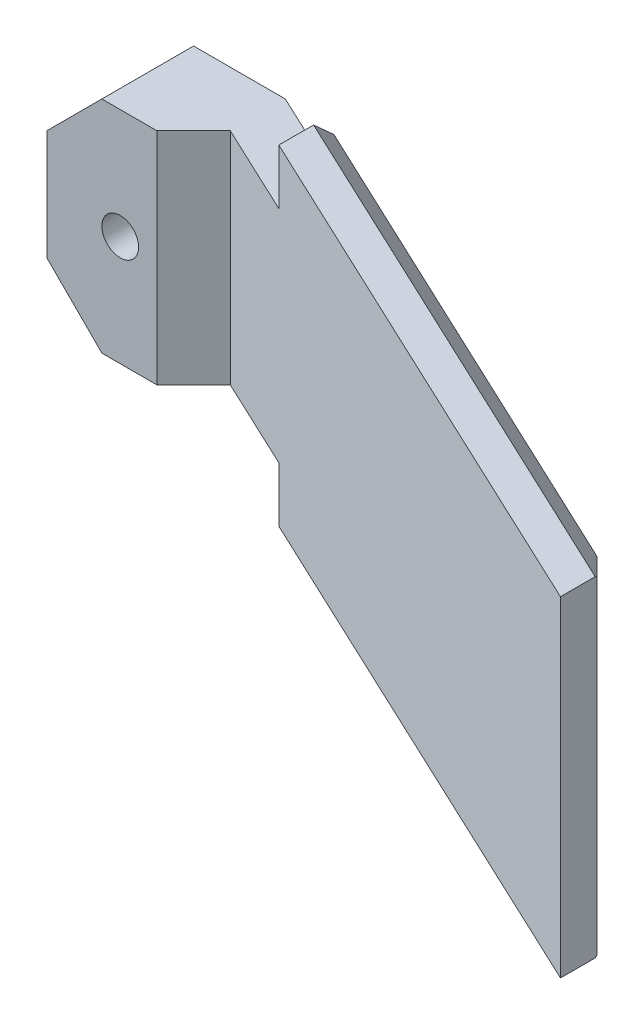
ISO-10303-21;
HEADER;
FILE_DESCRIPTION(('STEP AP214'),'2;1');
FILE_NAME('part.step','',(''),(''),'','','');
FILE_SCHEMA(('AUTOMOTIVE_DESIGN { 1 0 10303 214 1 1 1 1 }'));
ENDSEC;
DATA;
#1=APPLICATION_CONTEXT('core data for automotive mechanical design processes');
#2=APPLICATION_PROTOCOL_DEFINITION('international standard','automotive_design',2000,#1);
#3=PRODUCT_CONTEXT('',#1,'mechanical');
#4=PRODUCT('Part','Part','',(#3));
#5=PRODUCT_RELATED_PRODUCT_CATEGORY('part','',(#4));
#6=PRODUCT_DEFINITION_FORMATION('','',#4);
#7=PRODUCT_DEFINITION_CONTEXT('part definition',#1,'design');
#8=PRODUCT_DEFINITION('design','',#6,#7);
#9=PRODUCT_DEFINITION_SHAPE('','',#8);
#10=(LENGTH_UNIT() NAMED_UNIT(*) SI_UNIT(.MILLI.,.METRE.));
#11=(NAMED_UNIT(*) PLANE_ANGLE_UNIT() SI_UNIT($,.RADIAN.));
#12=(NAMED_UNIT(*) SI_UNIT($,.STERADIAN.) SOLID_ANGLE_UNIT());
#13=UNCERTAINTY_MEASURE_WITH_UNIT(LENGTH_MEASURE(1.E-05),#10,'distance_accuracy_value','');
#14=(GEOMETRIC_REPRESENTATION_CONTEXT(3) GLOBAL_UNCERTAINTY_ASSIGNED_CONTEXT((#13)) GLOBAL_UNIT_ASSIGNED_CONTEXT((#10,
#11,#12)) REPRESENTATION_CONTEXT('',''));
#15=CARTESIAN_POINT('',(0.,0.,0.));
#16=DIRECTION('',(0.,0.,1.));
#17=DIRECTION('',(1.,0.,0.));
#18=AXIS2_PLACEMENT_3D('',#15,#16,#17);
#19=CARTESIAN_POINT('',(4.,18.,-1.5));
#20=DIRECTION('',(-0.42579703632988,0.,0.904818702200994));
#21=DIRECTION('',(0.904818702200994,0.,0.42579703632988));
#22=AXIS2_PLACEMENT_3D('',#19,#20,#21);
#23=PLANE('',#22);
#24=DIRECTION('',(0.904818702200994,0.,0.42579703632988));
#25=VECTOR('',#24,1.);
#26=CARTESIAN_POINT('',(4.,17.,-1.5));
#27=LINE('',#26,#25);
#28=CARTESIAN_POINT('',(9.,17.,0.852941176470588));
#29=VERTEX_POINT('',#28);
#30=CARTESIAN_POINT('',(36.1111111111111,17.,13.6111111111111));
#31=VERTEX_POINT('',#30);
#32=EDGE_CURVE('E210',#29,#31,#27,.T.);
#33=ORIENTED_EDGE('',*,*,#32,.T.);
#34=DIRECTION('',(0.,-1.,0.));
#35=VECTOR('',#34,1.);
#36=CARTESIAN_POINT('',(36.1111111111111,18.,13.6111111111111));
#37=LINE('',#36,#35);
#38=CARTESIAN_POINT('',(36.1111111111111,1.,13.6111111111111));
#39=VERTEX_POINT('',#38);
#40=EDGE_CURVE('E236',#31,#39,#37,.T.);
#41=ORIENTED_EDGE('',*,*,#40,.T.);
#42=DIRECTION('',(-0.904818702200994,0.,-0.42579703632988));
#43=VECTOR('',#42,1.);
#44=CARTESIAN_POINT('',(9.,1.,0.852941176470587));
#45=LINE('',#44,#43);
#46=CARTESIAN_POINT('',(9.,1.,0.852941176470587));
#47=VERTEX_POINT('',#46);
#48=EDGE_CURVE('E213',#39,#47,#45,.T.);
#49=ORIENTED_EDGE('',*,*,#48,.T.);
#50=DIRECTION('',(0.,1.,0.));
#51=VECTOR('',#50,1.);
#52=CARTESIAN_POINT('',(9.,18.,0.852941176470587));
#53=LINE('',#52,#51);
#54=CARTESIAN_POINT('',(9.,3.,0.852941176470592));
#55=VERTEX_POINT('',#54);
#56=EDGE_CURVE('E178',#47,#55,#53,.T.);
#57=ORIENTED_EDGE('',*,*,#56,.T.);
#58=DIRECTION('',(-0.904818702200994,0.,-0.42579703632988));
#59=VECTOR('',#58,1.);
#60=CARTESIAN_POINT('',(4.,3.,-1.5));
#61=LINE('',#60,#59);
#62=CARTESIAN_POINT('',(4.,3.,-1.5));
#63=VERTEX_POINT('',#62);
#64=EDGE_CURVE('E162',#55,#63,#61,.T.);
#65=ORIENTED_EDGE('',*,*,#64,.T.);
#66=DIRECTION('',(0.,-1.,0.));
#67=VECTOR('',#66,1.);
#68=CARTESIAN_POINT('',(4.,18.,-1.5));
#69=LINE('',#68,#67);
#70=CARTESIAN_POINT('',(4.,15.,-1.5));
#71=VERTEX_POINT('',#70);
#72=EDGE_CURVE('E176',#71,#63,#69,.T.);
#73=ORIENTED_EDGE('',*,*,#72,.F.);
#74=DIRECTION('',(0.904818702200994,0.,0.42579703632988));
#75=VECTOR('',#74,1.);
#76=CARTESIAN_POINT('',(4.,15.,-1.5));
#77=LINE('',#76,#75);
#78=CARTESIAN_POINT('',(9.,15.,0.852941176470588));
#79=VERTEX_POINT('',#78);
#80=EDGE_CURVE('E180',#71,#79,#77,.T.);
#81=ORIENTED_EDGE('',*,*,#80,.T.);
#82=DIRECTION('',(0.,1.,0.));
#83=VECTOR('',#82,1.);
#84=CARTESIAN_POINT('',(9.,18.,0.852941176470588));
#85=LINE('',#84,#83);
#86=EDGE_CURVE('E181',#79,#29,#85,.T.);
#87=ORIENTED_EDGE('',*,*,#86,.T.);
#88=EDGE_LOOP('',(#33,#41,#49,#57,#65,#73,#81,#87));
#89=FACE_BOUND('',#88,.T.);
#90=ADVANCED_FACE('F44',(#89),#23,.F.);
#91=CARTESIAN_POINT('',(-4.,18.,-1.5));
#92=DIRECTION('',(0.,0.,1.));
#93=DIRECTION('',(1.,0.,0.));
#94=AXIS2_PLACEMENT_3D('',#91,#92,#93);
#95=PLANE('',#94);
#96=CARTESIAN_POINT('',(0.,9.,-1.5));
#97=DIRECTION('',(0.,0.,-1.));
#98=DIRECTION('',(-1.,0.,0.));
#99=AXIS2_PLACEMENT_3D('',#96,#97,#98);
#100=CIRCLE('',#99,2.5);
#101=CARTESIAN_POINT('',(-2.5,9.,-1.5));
#102=VERTEX_POINT('',#101);
#103=EDGE_CURVE('E316',#102,#102,#100,.T.);
#104=ORIENTED_EDGE('',*,*,#103,.F.);
#105=EDGE_LOOP('',(#104));
#106=FACE_BOUND('',#105,.T.);
#107=DIRECTION('',(0.,-1.,0.));
#108=VECTOR('',#107,1.);
#109=CARTESIAN_POINT('',(-4.,18.,-1.5));
#110=LINE('',#109,#108);
#111=CARTESIAN_POINT('',(-4.,12.,-1.5));
#112=VERTEX_POINT('',#111);
#113=CARTESIAN_POINT('',(-4.,6.00000000000001,-1.5));
#114=VERTEX_POINT('',#113);
#115=EDGE_CURVE('E189',#112,#114,#110,.T.);
#116=ORIENTED_EDGE('',*,*,#115,.F.);
#117=DIRECTION('',(-0.707106781186548,-0.707106781186547,0.));
#118=VECTOR('',#117,1.);
#119=CARTESIAN_POINT('',(-4.,12.,-1.5));
#120=LINE('',#119,#118);
#121=CARTESIAN_POINT('',(-0.99999999999999,15.,-1.5));
#122=VERTEX_POINT('',#121);
#123=EDGE_CURVE('E265',#112,#122,#120,.F.);
#124=ORIENTED_EDGE('',*,*,#123,.T.);
#125=DIRECTION('',(-1.,0.,0.));
#126=VECTOR('',#125,1.);
#127=CARTESIAN_POINT('',(-4.,15.,-1.5));
#128=LINE('',#127,#126);
#129=EDGE_CURVE('E169',#71,#122,#128,.T.);
#130=ORIENTED_EDGE('',*,*,#129,.F.);
#131=ORIENTED_EDGE('',*,*,#72,.T.);
#132=DIRECTION('',(1.,0.,0.));
#133=VECTOR('',#132,1.);
#134=CARTESIAN_POINT('',(-4.,3.,-1.5));
#135=LINE('',#134,#133);
#136=CARTESIAN_POINT('',(-1.,3.,-1.5));
#137=VERTEX_POINT('',#136);
#138=EDGE_CURVE('E158',#137,#63,#135,.T.);
#139=ORIENTED_EDGE('',*,*,#138,.F.);
#140=DIRECTION('',(0.707106781186546,-0.707106781186549,0.));
#141=VECTOR('',#140,1.);
#142=CARTESIAN_POINT('',(-1.,3.,-1.5));
#143=LINE('',#142,#141);
#144=EDGE_CURVE('E262',#137,#114,#143,.F.);
#145=ORIENTED_EDGE('',*,*,#144,.T.);
#146=EDGE_LOOP('',(#116,#124,#130,#131,#139,#145));
#147=FACE_BOUND('',#146,.T.);
#148=ADVANCED_FACE('F185',(#106,#147),#95,.F.);
#149=CARTESIAN_POINT('',(-4.,18.,1.5));
#150=DIRECTION('',(1.,0.,0.));
#151=DIRECTION('',(0.,0.,-1.));
#152=AXIS2_PLACEMENT_3D('',#149,#150,#151);
#153=PLANE('',#152);
#154=DIRECTION('',(0.,-1.,0.));
#155=VECTOR('',#154,1.);
#156=CARTESIAN_POINT('',(-4.,15.,3.5));
#157=LINE('',#156,#155);
#158=CARTESIAN_POINT('',(-4.,12.,3.5));
#159=VERTEX_POINT('',#158);
#160=CARTESIAN_POINT('',(-4.,6.00000000000001,3.5));
#161=VERTEX_POINT('',#160);
#162=EDGE_CURVE('E346',#159,#161,#157,.T.);
#163=ORIENTED_EDGE('',*,*,#162,.F.);
#164=DIRECTION('',(0.,0.,-1.));
#165=VECTOR('',#164,1.);
#166=CARTESIAN_POINT('',(-4.,12.,1.5));
#167=LINE('',#166,#165);
#168=EDGE_CURVE('E258',#159,#112,#167,.T.);
#169=ORIENTED_EDGE('',*,*,#168,.T.);
#170=ORIENTED_EDGE('',*,*,#115,.T.);
#171=DIRECTION('',(0.,0.,1.));
#172=VECTOR('',#171,1.);
#173=CARTESIAN_POINT('',(-4.,6.00000000000001,1.5));
#174=LINE('',#173,#172);
#175=EDGE_CURVE('E249',#114,#161,#174,.T.);
#176=ORIENTED_EDGE('',*,*,#175,.T.);
#177=EDGE_LOOP('',(#163,#169,#170,#176));
#178=FACE_BOUND('',#177,.T.);
#179=ADVANCED_FACE('F373',(#178),#153,.F.);
#180=CARTESIAN_POINT('',(4.,18.,1.5));
#181=DIRECTION('',(0.42579703632988,0.,-0.904818702200994));
#182=DIRECTION('',(-0.904818702200994,0.,-0.42579703632988));
#183=AXIS2_PLACEMENT_3D('',#180,#181,#182);
#184=PLANE('',#183);
#185=DIRECTION('',(0.,-1.,0.));
#186=VECTOR('',#185,1.);
#187=CARTESIAN_POINT('',(9.,18.,3.85294117647059));
#188=LINE('',#187,#186);
#189=CARTESIAN_POINT('',(9.,18.,3.85294117647059));
#190=VERTEX_POINT('',#189);
#191=CARTESIAN_POINT('',(9.,15.,3.85294117647059));
#192=VERTEX_POINT('',#191);
#193=EDGE_CURVE('E294',#190,#192,#188,.T.);
#194=ORIENTED_EDGE('',*,*,#193,.T.);
#195=DIRECTION('',(-0.904818702200994,0.,-0.42579703632988));
#196=VECTOR('',#195,1.);
#197=CARTESIAN_POINT('',(4.,15.,1.5));
#198=LINE('',#197,#196);
#199=CARTESIAN_POINT('',(4.,15.,1.5));
#200=VERTEX_POINT('',#199);
#201=EDGE_CURVE('E206',#192,#200,#198,.T.);
#202=ORIENTED_EDGE('',*,*,#201,.T.);
#203=DIRECTION('',(0.,-1.,0.));
#204=VECTOR('',#203,1.);
#205=CARTESIAN_POINT('',(4.,18.,1.5));
#206=LINE('',#205,#204);
#207=CARTESIAN_POINT('',(4.,3.,1.5));
#208=VERTEX_POINT('',#207);
#209=EDGE_CURVE('E196',#200,#208,#206,.T.);
#210=ORIENTED_EDGE('',*,*,#209,.T.);
#211=DIRECTION('',(0.904818702200994,0.,0.42579703632988));
#212=VECTOR('',#211,1.);
#213=CARTESIAN_POINT('',(4.,3.,1.5));
#214=LINE('',#213,#212);
#215=CARTESIAN_POINT('',(9.,3.,3.85294117647059));
#216=VERTEX_POINT('',#215);
#217=EDGE_CURVE('E202',#208,#216,#214,.T.);
#218=ORIENTED_EDGE('',*,*,#217,.T.);
#219=DIRECTION('',(0.,-1.,0.));
#220=VECTOR('',#219,1.);
#221=CARTESIAN_POINT('',(9.,18.,3.85294117647059));
#222=LINE('',#221,#220);
#223=CARTESIAN_POINT('',(9.,0.,3.85294117647059));
#224=VERTEX_POINT('',#223);
#225=EDGE_CURVE('E332',#216,#224,#222,.T.);
#226=ORIENTED_EDGE('',*,*,#225,.T.);
#227=DIRECTION('',(0.904818702200994,0.,0.42579703632988));
#228=VECTOR('',#227,1.);
#229=CARTESIAN_POINT('',(4.,0.,1.5));
#230=LINE('',#229,#228);
#231=CARTESIAN_POINT('',(38.,0.,17.5));
#232=VERTEX_POINT('',#231);
#233=EDGE_CURVE('E307',#224,#232,#230,.T.);
#234=ORIENTED_EDGE('',*,*,#233,.T.);
#235=DIRECTION('',(0.,-1.,0.));
#236=VECTOR('',#235,1.);
#237=CARTESIAN_POINT('',(38.,18.,17.5));
#238=LINE('',#237,#236);
#239=CARTESIAN_POINT('',(38.,18.,17.5));
#240=VERTEX_POINT('',#239);
#241=EDGE_CURVE('E296',#240,#232,#238,.T.);
#242=ORIENTED_EDGE('',*,*,#241,.F.);
#243=DIRECTION('',(0.904818702200994,0.,0.42579703632988));
#244=VECTOR('',#243,1.);
#245=CARTESIAN_POINT('',(4.,18.,1.5));
#246=LINE('',#245,#244);
#247=EDGE_CURVE('E306',#190,#240,#246,.T.);
#248=ORIENTED_EDGE('',*,*,#247,.F.);
#249=EDGE_LOOP('',(#194,#202,#210,#218,#226,#234,#242,#248));
#250=FACE_BOUND('',#249,.T.);
#251=ADVANCED_FACE('F291',(#250),#184,.F.);
#252=CARTESIAN_POINT('',(38.,18.,14.5));
#253=DIRECTION('',(-1.,0.,0.));
#254=DIRECTION('',(0.,0.,1.));
#255=AXIS2_PLACEMENT_3D('',#252,#253,#254);
#256=PLANE('',#255);
#257=DIRECTION('',(0.,0.670936482269277,-0.741514825718359));
#258=VECTOR('',#257,1.);
#259=CARTESIAN_POINT('',(38.,8.96014957948787,5.70249221183795));
#260=LINE('',#259,#258);
#261=CARTESIAN_POINT('',(38.,0.,15.6051937781209));
#262=VERTEX_POINT('',#261);
#263=CARTESIAN_POINT('',(38.,0.0951812977990005,15.5));
#264=VERTEX_POINT('',#263);
#265=EDGE_CURVE('E225',#262,#264,#260,.T.);
#266=ORIENTED_EDGE('',*,*,#265,.T.);
#267=DIRECTION('',(0.,1.,0.));
#268=VECTOR('',#267,1.);
#269=CARTESIAN_POINT('',(38.,18.,15.5));
#270=LINE('',#269,#268);
#271=CARTESIAN_POINT('',(38.,17.904818702201,15.5));
#272=VERTEX_POINT('',#271);
#273=EDGE_CURVE('E243',#264,#272,#270,.T.);
#274=ORIENTED_EDGE('',*,*,#273,.T.);
#275=DIRECTION('',(0.,-0.67093648226928,-0.741514825718356));
#276=VECTOR('',#275,1.);
#277=CARTESIAN_POINT('',(38.,9.30876198034695,5.99969159463225));
#278=LINE('',#277,#276);
#279=CARTESIAN_POINT('',(38.,18.,15.6051937781209));
#280=VERTEX_POINT('',#279);
#281=EDGE_CURVE('E222',#272,#280,#278,.F.);
#282=ORIENTED_EDGE('',*,*,#281,.T.);
#283=DIRECTION('',(0.,0.,-1.));
#284=VECTOR('',#283,1.);
#285=CARTESIAN_POINT('',(38.,18.,14.5));
#286=LINE('',#285,#284);
#287=EDGE_CURVE('E299',#240,#280,#286,.T.);
#288=ORIENTED_EDGE('',*,*,#287,.F.);
#289=ORIENTED_EDGE('',*,*,#241,.T.);
#290=DIRECTION('',(0.,0.,-1.));
#291=VECTOR('',#290,1.);
#292=CARTESIAN_POINT('',(38.,0.,14.5));
#293=LINE('',#292,#291);
#294=EDGE_CURVE('E302',#232,#262,#293,.T.);
#295=ORIENTED_EDGE('',*,*,#294,.T.);
#296=EDGE_LOOP('',(#266,#274,#282,#288,#289,#295));
#297=FACE_BOUND('',#296,.T.);
#298=ADVANCED_FACE('F449',(#297),#256,.F.);
#299=CARTESIAN_POINT('',(0.,18.,0.));
#300=DIRECTION('',(0.,-1.,0.));
#301=DIRECTION('',(0.,0.,-1.));
#302=AXIS2_PLACEMENT_3D('',#299,#300,#301);
#303=PLANE('',#302);
#304=ORIENTED_EDGE('',*,*,#287,.T.);
#305=DIRECTION('',(-0.904818702200994,0.,-0.42579703632988));
#306=VECTOR('',#305,1.);
#307=CARTESIAN_POINT('',(0.877319110978902,18.,-1.86430311083017));
#308=LINE('',#307,#306);
#309=CARTESIAN_POINT('',(9.,18.,1.95813495459153));
#310=VERTEX_POINT('',#309);
#311=EDGE_CURVE('E229',#280,#310,#308,.T.);
#312=ORIENTED_EDGE('',*,*,#311,.T.);
#313=DIRECTION('',(0.,0.,1.));
#314=VECTOR('',#313,1.);
#315=CARTESIAN_POINT('',(9.,18.,0.));
#316=LINE('',#315,#314);
#317=EDGE_CURVE('E193',#310,#190,#316,.T.);
#318=ORIENTED_EDGE('',*,*,#317,.T.);
#319=ORIENTED_EDGE('',*,*,#247,.T.);
#320=EDGE_LOOP('',(#304,#312,#318,#319));
#321=FACE_BOUND('',#320,.T.);
#322=ADVANCED_FACE('F452',(#321),#303,.F.);
#323=CARTESIAN_POINT('',(0.,0.,0.));
#324=DIRECTION('',(0.,-1.,0.));
#325=DIRECTION('',(0.,0.,-1.));
#326=AXIS2_PLACEMENT_3D('',#323,#324,#325);
#327=PLANE('',#326);
#328=DIRECTION('',(0.,0.,1.));
#329=VECTOR('',#328,1.);
#330=CARTESIAN_POINT('',(9.,0.,0.));
#331=LINE('',#330,#329);
#332=CARTESIAN_POINT('',(9.,0.,1.95813495459153));
#333=VERTEX_POINT('',#332);
#334=EDGE_CURVE('E188',#333,#224,#331,.T.);
#335=ORIENTED_EDGE('',*,*,#334,.F.);
#336=DIRECTION('',(0.904818702200994,0.,0.42579703632988));
#337=VECTOR('',#336,1.);
#338=CARTESIAN_POINT('',(37.5742029636701,0.,15.404818702201));
#339=LINE('',#338,#337);
#340=EDGE_CURVE('E219',#333,#262,#339,.T.);
#341=ORIENTED_EDGE('',*,*,#340,.T.);
#342=ORIENTED_EDGE('',*,*,#294,.F.);
#343=ORIENTED_EDGE('',*,*,#233,.F.);
#344=EDGE_LOOP('',(#335,#341,#342,#343));
#345=FACE_BOUND('',#344,.T.);
#346=ADVANCED_FACE('F368',(#345),#327,.T.);
#347=CARTESIAN_POINT('',(0.,9.,1.));
#348=DIRECTION('',(0.,0.,-1.));
#349=DIRECTION('',(-1.,0.,0.));
#350=AXIS2_PLACEMENT_3D('',#347,#348,#349);
#351=CYLINDRICAL_SURFACE('',#350,2.5);
#352=CARTESIAN_POINT('',(0.,9.,1.));
#353=DIRECTION('',(0.,0.,-1.));
#354=DIRECTION('',(-1.,0.,0.));
#355=AXIS2_PLACEMENT_3D('',#352,#353,#354);
#356=CIRCLE('',#355,2.5);
#357=CARTESIAN_POINT('',(-2.5,9.,1.));
#358=VERTEX_POINT('',#357);
#359=EDGE_CURVE('E310',#358,#358,#356,.T.);
#360=ORIENTED_EDGE('',*,*,#359,.F.);
#361=EDGE_LOOP('',(#360));
#362=FACE_BOUND('',#361,.T.);
#363=ORIENTED_EDGE('',*,*,#103,.T.);
#364=EDGE_LOOP('',(#363));
#365=FACE_BOUND('',#364,.T.);
#366=ADVANCED_FACE('F362',(#362,#365),#351,.F.);
#367=CARTESIAN_POINT('',(0.,9.,1.));
#368=DIRECTION('',(0.,0.,-1.));
#369=DIRECTION('',(-1.,0.,0.));
#370=AXIS2_PLACEMENT_3D('',#367,#368,#369);
#371=PLANE('',#370);
#372=CARTESIAN_POINT('',(0.,9.,1.));
#373=DIRECTION('',(0.,0.,-1.));
#374=DIRECTION('',(-1.,0.,0.));
#375=AXIS2_PLACEMENT_3D('',#372,#373,#374);
#376=CIRCLE('',#375,1.);
#377=CARTESIAN_POINT('',(-0.999999999999999,9.,1.));
#378=VERTEX_POINT('',#377);
#379=EDGE_CURVE('E255',#378,#378,#376,.T.);
#380=ORIENTED_EDGE('',*,*,#379,.F.);
#381=EDGE_LOOP('',(#380));
#382=FACE_BOUND('',#381,.T.);
#383=ORIENTED_EDGE('',*,*,#359,.T.);
#384=EDGE_LOOP('',(#383));
#385=FACE_BOUND('',#384,.T.);
#386=ADVANCED_FACE('F359',(#382,#385),#371,.T.);
#387=CARTESIAN_POINT('',(-4.,3.,17.5));
#388=DIRECTION('',(0.,1.,0.));
#389=DIRECTION('',(-1.,0.,0.));
#390=AXIS2_PLACEMENT_3D('',#387,#388,#389);
#391=PLANE('',#390);
#392=ORIENTED_EDGE('',*,*,#217,.F.);
#393=DIRECTION('',(0.707106781186545,0.,-0.70710678118655));
#394=VECTOR('',#393,1.);
#395=CARTESIAN_POINT('',(2.,3.,3.5));
#396=LINE('',#395,#394);
#397=CARTESIAN_POINT('',(2.,3.,3.5));
#398=VERTEX_POINT('',#397);
#399=EDGE_CURVE('E11',#208,#398,#396,.F.);
#400=ORIENTED_EDGE('',*,*,#399,.T.);
#401=DIRECTION('',(1.,0.,0.));
#402=VECTOR('',#401,1.);
#403=CARTESIAN_POINT('',(4.,3.,3.5));
#404=LINE('',#403,#402);
#405=CARTESIAN_POINT('',(-1.,3.,3.5));
#406=VERTEX_POINT('',#405);
#407=EDGE_CURVE('E339',#406,#398,#404,.T.);
#408=ORIENTED_EDGE('',*,*,#407,.F.);
#409=DIRECTION('',(0.,0.,-1.));
#410=VECTOR('',#409,1.);
#411=CARTESIAN_POINT('',(-1.,3.,17.5));
#412=LINE('',#411,#410);
#413=EDGE_CURVE('E165',#406,#137,#412,.T.);
#414=ORIENTED_EDGE('',*,*,#413,.T.);
#415=ORIENTED_EDGE('',*,*,#138,.T.);
#416=ORIENTED_EDGE('',*,*,#64,.F.);
#417=DIRECTION('',(0.,0.,-1.));
#418=VECTOR('',#417,1.);
#419=CARTESIAN_POINT('',(9.,3.,17.5));
#420=LINE('',#419,#418);
#421=EDGE_CURVE('E170',#216,#55,#420,.T.);
#422=ORIENTED_EDGE('',*,*,#421,.F.);
#423=EDGE_LOOP('',(#392,#400,#408,#414,#415,#416,#422));
#424=FACE_BOUND('',#423,.T.);
#425=ADVANCED_FACE('F160',(#424),#391,.F.);
#426=CARTESIAN_POINT('',(9.,0.,17.5));
#427=DIRECTION('',(1.,0.,0.));
#428=DIRECTION('',(0.,0.,-1.));
#429=AXIS2_PLACEMENT_3D('',#426,#427,#428);
#430=PLANE('',#429);
#431=ORIENTED_EDGE('',*,*,#56,.F.);
#432=DIRECTION('',(0.,-0.670936482269277,0.741514825718359));
#433=VECTOR('',#432,1.);
#434=CARTESIAN_POINT('',(9.,2.17061023227763,-0.440809968847361));
#435=LINE('',#434,#433);
#436=EDGE_CURVE('E216',#47,#333,#435,.T.);
#437=ORIENTED_EDGE('',*,*,#436,.T.);
#438=ORIENTED_EDGE('',*,*,#334,.T.);
#439=ORIENTED_EDGE('',*,*,#225,.F.);
#440=ORIENTED_EDGE('',*,*,#421,.T.);
#441=EDGE_LOOP('',(#431,#437,#438,#439,#440));
#442=FACE_BOUND('',#441,.T.);
#443=ADVANCED_FACE('F443',(#442),#430,.F.);
#444=CARTESIAN_POINT('',(-4.,15.,17.5));
#445=DIRECTION('',(0.,-1.,0.));
#446=DIRECTION('',(1.,0.,0.));
#447=AXIS2_PLACEMENT_3D('',#444,#445,#446);
#448=PLANE('',#447);
#449=DIRECTION('',(-1.,0.,0.));
#450=VECTOR('',#449,1.);
#451=CARTESIAN_POINT('',(4.,15.,3.5));
#452=LINE('',#451,#450);
#453=CARTESIAN_POINT('',(2.,15.,3.5));
#454=VERTEX_POINT('',#453);
#455=CARTESIAN_POINT('',(-0.99999999999999,15.,3.5));
#456=VERTEX_POINT('',#455);
#457=EDGE_CURVE('E254',#454,#456,#452,.T.);
#458=ORIENTED_EDGE('',*,*,#457,.F.);
#459=DIRECTION('',(-0.707106781186545,0.,0.70710678118655));
#460=VECTOR('',#459,1.);
#461=CARTESIAN_POINT('',(2.,15.,3.5));
#462=LINE('',#461,#460);
#463=EDGE_CURVE('E54',#454,#200,#462,.F.);
#464=ORIENTED_EDGE('',*,*,#463,.T.);
#465=ORIENTED_EDGE('',*,*,#201,.F.);
#466=DIRECTION('',(0.,0.,-1.));
#467=VECTOR('',#466,1.);
#468=CARTESIAN_POINT('',(9.,15.,17.5));
#469=LINE('',#468,#467);
#470=EDGE_CURVE('E335',#192,#79,#469,.T.);
#471=ORIENTED_EDGE('',*,*,#470,.T.);
#472=ORIENTED_EDGE('',*,*,#80,.F.);
#473=ORIENTED_EDGE('',*,*,#129,.T.);
#474=DIRECTION('',(0.,0.,1.));
#475=VECTOR('',#474,1.);
#476=CARTESIAN_POINT('',(-0.99999999999999,15.,17.5));
#477=LINE('',#476,#475);
#478=EDGE_CURVE('E268',#122,#456,#477,.T.);
#479=ORIENTED_EDGE('',*,*,#478,.T.);
#480=EDGE_LOOP('',(#458,#464,#465,#471,#472,#473,#479));
#481=FACE_BOUND('',#480,.T.);
#482=ADVANCED_FACE('F285',(#481),#448,.F.);
#483=CARTESIAN_POINT('',(9.,18.,17.5));
#484=DIRECTION('',(1.,0.,0.));
#485=DIRECTION('',(0.,0.,-1.));
#486=AXIS2_PLACEMENT_3D('',#483,#484,#485);
#487=PLANE('',#486);
#488=ORIENTED_EDGE('',*,*,#317,.F.);
#489=DIRECTION('',(0.,0.67093648226928,0.741514825718356));
#490=VECTOR('',#489,1.);
#491=CARTESIAN_POINT('',(9.,16.0983013275572,-0.143610586053112));
#492=LINE('',#491,#490);
#493=EDGE_CURVE('E233',#310,#29,#492,.F.);
#494=ORIENTED_EDGE('',*,*,#493,.T.);
#495=ORIENTED_EDGE('',*,*,#86,.F.);
#496=ORIENTED_EDGE('',*,*,#470,.F.);
#497=ORIENTED_EDGE('',*,*,#193,.F.);
#498=EDGE_LOOP('',(#488,#494,#495,#496,#497));
#499=FACE_BOUND('',#498,.T.);
#500=ADVANCED_FACE('F393',(#499),#487,.F.);
#501=CARTESIAN_POINT('',(4.,1.,-1.5));
#502=DIRECTION('',(0.301083971797992,-0.70710678118655,-0.639803440070732));
#503=DIRECTION('',(0.904818702200994,0.,0.42579703632988));
#504=AXIS2_PLACEMENT_3D('',#501,#502,#503);
#505=PLANE('',#504);
#506=ORIENTED_EDGE('',*,*,#48,.F.);
#507=DIRECTION('',(-0.669730359745565,0.320815352609786,-0.669730359745573));
#508=VECTOR('',#507,1.);
#509=CARTESIAN_POINT('',(14.930114358323,11.1461563493314,-7.5698856416773));
#510=LINE('',#509,#508);
#511=EDGE_CURVE('E240',#39,#264,#510,.F.);
#512=ORIENTED_EDGE('',*,*,#511,.T.);
#513=ORIENTED_EDGE('',*,*,#265,.F.);
#514=ORIENTED_EDGE('',*,*,#340,.F.);
#515=ORIENTED_EDGE('',*,*,#436,.F.);
#516=EDGE_LOOP('',(#506,#512,#513,#514,#515));
#517=FACE_BOUND('',#516,.T.);
#518=ADVANCED_FACE('F386',(#517),#505,.T.);
#519=CARTESIAN_POINT('',(0.877319110978902,18.,-1.86430311083017));
#520=DIRECTION('',(-0.301083971797993,-0.707106781186548,0.639803440070734));
#521=DIRECTION('',(-0.904818702200994,0.,-0.42579703632988));
#522=AXIS2_PLACEMENT_3D('',#519,#520,#521);
#523=PLANE('',#522);
#524=ORIENTED_EDGE('',*,*,#281,.F.);
#525=DIRECTION('',(-0.669730359745564,-0.320815352609788,-0.669730359745572));
#526=VECTOR('',#525,1.);
#527=CARTESIAN_POINT('',(13.5809266786598,6.20755352078344,-8.91907332134053));
#528=LINE('',#527,#526);
#529=EDGE_CURVE('E246',#272,#31,#528,.T.);
#530=ORIENTED_EDGE('',*,*,#529,.T.);
#531=ORIENTED_EDGE('',*,*,#32,.F.);
#532=ORIENTED_EDGE('',*,*,#493,.F.);
#533=ORIENTED_EDGE('',*,*,#311,.F.);
#534=EDGE_LOOP('',(#524,#530,#531,#532,#533));
#535=FACE_BOUND('',#534,.T.);
#536=ADVANCED_FACE('F392',(#535),#523,.F.);
#537=CARTESIAN_POINT('',(36.1111111111111,18.,13.6111111111111));
#538=DIRECTION('',(-0.707106781186552,0.,0.707106781186543));
#539=DIRECTION('',(0.,-1.,0.));
#540=AXIS2_PLACEMENT_3D('',#537,#538,#539);
#541=PLANE('',#540);
#542=ORIENTED_EDGE('',*,*,#529,.F.);
#543=ORIENTED_EDGE('',*,*,#273,.F.);
#544=ORIENTED_EDGE('',*,*,#511,.F.);
#545=ORIENTED_EDGE('',*,*,#40,.F.);
#546=EDGE_LOOP('',(#542,#543,#544,#545));
#547=FACE_BOUND('',#546,.T.);
#548=ADVANCED_FACE('F400',(#547),#541,.F.);
#549=CARTESIAN_POINT('',(0.,0.,3.5));
#550=DIRECTION('',(0.,0.,-1.));
#551=DIRECTION('',(-1.,0.,0.));
#552=AXIS2_PLACEMENT_3D('',#549,#550,#551);
#553=PLANE('',#552);
#554=CARTESIAN_POINT('',(0.,9.,3.5));
#555=DIRECTION('',(0.,0.,-1.));
#556=DIRECTION('',(-1.,0.,0.));
#557=AXIS2_PLACEMENT_3D('',#554,#555,#556);
#558=CIRCLE('',#557,1.);
#559=CARTESIAN_POINT('',(-0.999999999999999,9.,3.5));
#560=VERTEX_POINT('',#559);
#561=EDGE_CURVE('E250',#560,#560,#558,.T.);
#562=ORIENTED_EDGE('',*,*,#561,.T.);
#563=EDGE_LOOP('',(#562));
#564=FACE_BOUND('',#563,.T.);
#565=ORIENTED_EDGE('',*,*,#407,.T.);
#566=DIRECTION('',(0.,1.,0.));
#567=VECTOR('',#566,1.);
#568=CARTESIAN_POINT('',(2.,0.,3.5));
#569=LINE('',#568,#567);
#570=EDGE_CURVE('E280',#398,#454,#569,.T.);
#571=ORIENTED_EDGE('',*,*,#570,.T.);
#572=ORIENTED_EDGE('',*,*,#457,.T.);
#573=DIRECTION('',(0.707106781186548,0.707106781186547,0.));
#574=VECTOR('',#573,1.);
#575=CARTESIAN_POINT('',(-4.,12.,3.5));
#576=LINE('',#575,#574);
#577=EDGE_CURVE('E275',#456,#159,#576,.F.);
#578=ORIENTED_EDGE('',*,*,#577,.T.);
#579=ORIENTED_EDGE('',*,*,#162,.T.);
#580=DIRECTION('',(-0.707106781186546,0.707106781186549,0.));
#581=VECTOR('',#580,1.);
#582=CARTESIAN_POINT('',(-1.,3.,3.5));
#583=LINE('',#582,#581);
#584=EDGE_CURVE('E272',#161,#406,#583,.F.);
#585=ORIENTED_EDGE('',*,*,#584,.T.);
#586=EDGE_LOOP('',(#565,#571,#572,#578,#579,#585));
#587=FACE_BOUND('',#586,.T.);
#588=ADVANCED_FACE('F407',(#564,#587),#553,.F.);
#589=CARTESIAN_POINT('',(0.,9.,17.5));
#590=DIRECTION('',(0.,0.,-1.));
#591=DIRECTION('',(-1.,0.,0.));
#592=AXIS2_PLACEMENT_3D('',#589,#590,#591);
#593=CYLINDRICAL_SURFACE('',#592,1.);
#594=ORIENTED_EDGE('',*,*,#379,.T.);
#595=EDGE_LOOP('',(#594));
#596=FACE_BOUND('',#595,.T.);
#597=ORIENTED_EDGE('',*,*,#561,.F.);
#598=EDGE_LOOP('',(#597));
#599=FACE_BOUND('',#598,.T.);
#600=ADVANCED_FACE('F356',(#596,#599),#593,.F.);
#601=CARTESIAN_POINT('',(-4.,12.,1.5));
#602=DIRECTION('',(0.707106781186547,-0.707106781186548,0.));
#603=DIRECTION('',(0.,0.,-1.));
#604=AXIS2_PLACEMENT_3D('',#601,#602,#603);
#605=PLANE('',#604);
#606=ORIENTED_EDGE('',*,*,#577,.F.);
#607=ORIENTED_EDGE('',*,*,#478,.F.);
#608=ORIENTED_EDGE('',*,*,#123,.F.);
#609=ORIENTED_EDGE('',*,*,#168,.F.);
#610=EDGE_LOOP('',(#606,#607,#608,#609));
#611=FACE_BOUND('',#610,.T.);
#612=ADVANCED_FACE('F409',(#611),#605,.F.);
#613=CARTESIAN_POINT('',(-1.,3.,17.5));
#614=DIRECTION('',(0.707106781186549,0.707106781186546,0.));
#615=DIRECTION('',(0.,0.,-1.));
#616=AXIS2_PLACEMENT_3D('',#613,#614,#615);
#617=PLANE('',#616);
#618=ORIENTED_EDGE('',*,*,#584,.F.);
#619=ORIENTED_EDGE('',*,*,#175,.F.);
#620=ORIENTED_EDGE('',*,*,#144,.F.);
#621=ORIENTED_EDGE('',*,*,#413,.F.);
#622=EDGE_LOOP('',(#618,#619,#620,#621));
#623=FACE_BOUND('',#622,.T.);
#624=ADVANCED_FACE('F414',(#623),#617,.F.);
#625=CARTESIAN_POINT('',(2.,0.,3.5));
#626=DIRECTION('',(-0.70710678118655,0.,-0.707106781186545));
#627=DIRECTION('',(0.,1.,0.));
#628=AXIS2_PLACEMENT_3D('',#625,#626,#627);
#629=PLANE('',#628);
#630=ORIENTED_EDGE('',*,*,#399,.F.);
#631=ORIENTED_EDGE('',*,*,#209,.F.);
#632=ORIENTED_EDGE('',*,*,#463,.F.);
#633=ORIENTED_EDGE('',*,*,#570,.F.);
#634=EDGE_LOOP('',(#630,#631,#632,#633));
#635=FACE_BOUND('',#634,.T.);
#636=ADVANCED_FACE('F47',(#635),#629,.F.);
#637=CLOSED_SHELL('',(#90,#148,#179,#251,#298,#322,#346,#366,#386,#425,#443,#482,#500,#518,#536,
#548,#588,#600,#612,#624,#636));
#638=MANIFOLD_SOLID_BREP('B2',#637);
#639=ADVANCED_BREP_SHAPE_REPRESENTATION('',(#18,#638),#14);
#640=SHAPE_DEFINITION_REPRESENTATION(#9,#639);
ENDSEC;
END-ISO-10303-21;
